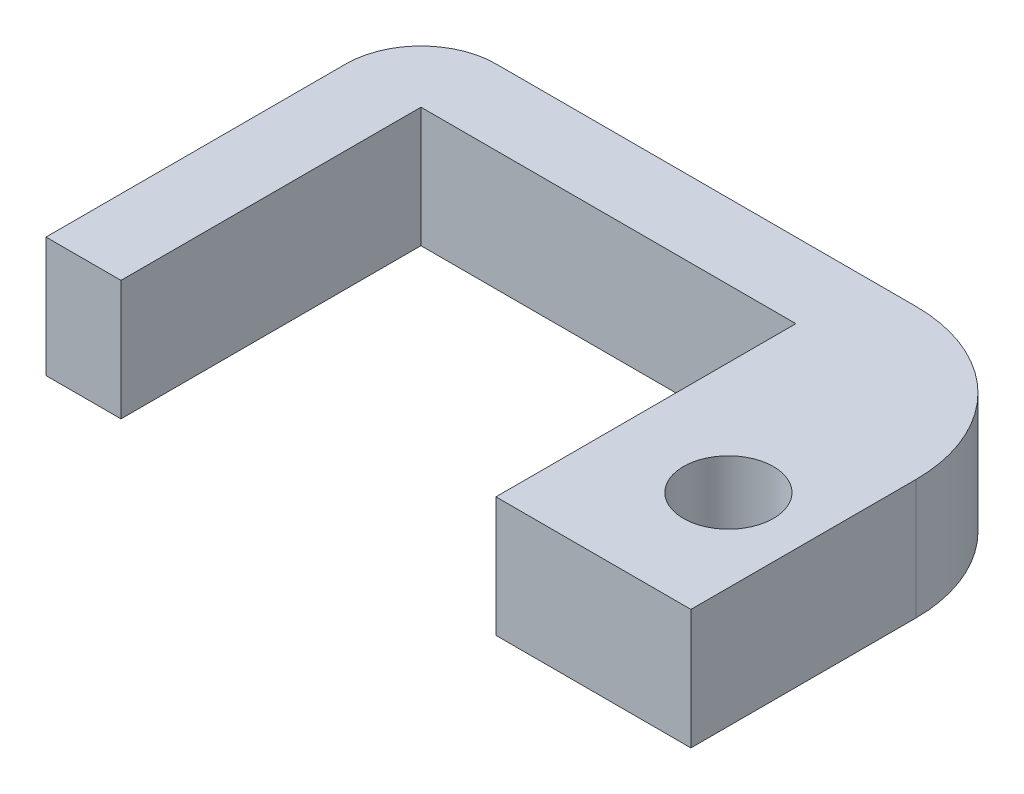
ISO-10303-21;
HEADER;
FILE_DESCRIPTION(('STEP AP214'),'2;1');
FILE_NAME('part.step','',(''),(''),'','','');
FILE_SCHEMA(('AUTOMOTIVE_DESIGN { 1 0 10303 214 1 1 1 1 }'));
ENDSEC;
DATA;
#1=APPLICATION_CONTEXT('core data for automotive mechanical design processes');
#2=APPLICATION_PROTOCOL_DEFINITION('international standard','automotive_design',2000,#1);
#3=PRODUCT_CONTEXT('',#1,'mechanical');
#4=PRODUCT('Part','Part','',(#3));
#5=PRODUCT_RELATED_PRODUCT_CATEGORY('part','',(#4));
#6=PRODUCT_DEFINITION_FORMATION('','',#4);
#7=PRODUCT_DEFINITION_CONTEXT('part definition',#1,'design');
#8=PRODUCT_DEFINITION('design','',#6,#7);
#9=PRODUCT_DEFINITION_SHAPE('','',#8);
#10=(LENGTH_UNIT() NAMED_UNIT(*) SI_UNIT(.MILLI.,.METRE.));
#11=(NAMED_UNIT(*) PLANE_ANGLE_UNIT() SI_UNIT($,.RADIAN.));
#12=(NAMED_UNIT(*) SI_UNIT($,.STERADIAN.) SOLID_ANGLE_UNIT());
#13=UNCERTAINTY_MEASURE_WITH_UNIT(LENGTH_MEASURE(1.E-05),#10,'distance_accuracy_value','');
#14=(GEOMETRIC_REPRESENTATION_CONTEXT(3) GLOBAL_UNCERTAINTY_ASSIGNED_CONTEXT((#13)) GLOBAL_UNIT_ASSIGNED_CONTEXT((#10,
#11,#12)) REPRESENTATION_CONTEXT('',''));
#15=CARTESIAN_POINT('',(0.,0.,0.));
#16=DIRECTION('',(0.,0.,1.));
#17=DIRECTION('',(1.,0.,0.));
#18=AXIS2_PLACEMENT_3D('',#15,#16,#17);
#19=CARTESIAN_POINT('',(28.,8.,-15.));
#20=DIRECTION('',(0.,-1.,0.));
#21=DIRECTION('',(0.,0.,-1.));
#22=AXIS2_PLACEMENT_3D('',#19,#20,#21);
#23=PLANE('',#22);
#24=CARTESIAN_POINT('',(32.5,8.,-8.));
#25=DIRECTION('',(0.,-1.,0.));
#26=DIRECTION('',(0.,0.,-1.));
#27=AXIS2_PLACEMENT_3D('',#24,#25,#26);
#28=CIRCLE('',#27,3.);
#29=CARTESIAN_POINT('',(32.5,8.,-11.));
#30=VERTEX_POINT('',#29);
#31=EDGE_CURVE('E146',#30,#30,#28,.T.);
#32=ORIENTED_EDGE('',*,*,#31,.T.);
#33=EDGE_LOOP('',(#32));
#34=FACE_BOUND('',#33,.T.);
#35=DIRECTION('',(1.,0.,0.));
#36=VECTOR('',#35,1.);
#37=CARTESIAN_POINT('',(-5.,8.,0.));
#38=LINE('',#37,#36);
#39=CARTESIAN_POINT('',(-5.,8.,0.));
#40=VERTEX_POINT('',#39);
#41=CARTESIAN_POINT('',(0.,8.,0.));
#42=VERTEX_POINT('',#41);
#43=EDGE_CURVE('E161',#40,#42,#38,.T.);
#44=ORIENTED_EDGE('',*,*,#43,.T.);
#45=DIRECTION('',(0.,0.,-1.));
#46=VECTOR('',#45,1.);
#47=CARTESIAN_POINT('',(0.,8.,0.));
#48=LINE('',#47,#46);
#49=CARTESIAN_POINT('',(0.,8.,-20.));
#50=VERTEX_POINT('',#49);
#51=EDGE_CURVE('E100',#42,#50,#48,.T.);
#52=ORIENTED_EDGE('',*,*,#51,.T.);
#53=DIRECTION('',(1.,0.,0.));
#54=VECTOR('',#53,1.);
#55=CARTESIAN_POINT('',(0.,8.,-20.));
#56=LINE('',#55,#54);
#57=CARTESIAN_POINT('',(25.,8.,-20.));
#58=VERTEX_POINT('',#57);
#59=EDGE_CURVE('E182',#50,#58,#56,.T.);
#60=ORIENTED_EDGE('',*,*,#59,.T.);
#61=DIRECTION('',(0.,0.,1.));
#62=VECTOR('',#61,1.);
#63=CARTESIAN_POINT('',(25.,8.,0.));
#64=LINE('',#63,#62);
#65=CARTESIAN_POINT('',(25.,8.,0.));
#66=VERTEX_POINT('',#65);
#67=EDGE_CURVE('E200',#58,#66,#64,.T.);
#68=ORIENTED_EDGE('',*,*,#67,.T.);
#69=DIRECTION('',(1.,0.,0.));
#70=VECTOR('',#69,1.);
#71=CARTESIAN_POINT('',(25.,8.,0.));
#72=LINE('',#71,#70);
#73=CARTESIAN_POINT('',(38.,8.,0.));
#74=VERTEX_POINT('',#73);
#75=EDGE_CURVE('E197',#66,#74,#72,.T.);
#76=ORIENTED_EDGE('',*,*,#75,.T.);
#77=DIRECTION('',(0.,0.,-1.));
#78=VECTOR('',#77,1.);
#79=CARTESIAN_POINT('',(38.,8.,0.));
#80=LINE('',#79,#78);
#81=CARTESIAN_POINT('',(38.,8.,-14.9999999999999));
#82=VERTEX_POINT('',#81);
#83=EDGE_CURVE('E199',#74,#82,#80,.T.);
#84=ORIENTED_EDGE('',*,*,#83,.T.);
#85=CARTESIAN_POINT('',(28.,8.,-15.));
#86=DIRECTION('',(0.,1.,0.));
#87=DIRECTION('',(0.,0.,-1.));
#88=AXIS2_PLACEMENT_3D('',#85,#86,#87);
#89=CIRCLE('',#88,10.);
#90=CARTESIAN_POINT('',(27.9999999999999,8.,-25.));
#91=VERTEX_POINT('',#90);
#92=EDGE_CURVE('E124',#82,#91,#89,.T.);
#93=ORIENTED_EDGE('',*,*,#92,.T.);
#94=DIRECTION('',(-1.,0.,0.));
#95=VECTOR('',#94,1.);
#96=CARTESIAN_POINT('',(27.9999999999999,8.,-25.));
#97=LINE('',#96,#95);
#98=CARTESIAN_POINT('',(0.,8.,-25.));
#99=VERTEX_POINT('',#98);
#100=EDGE_CURVE('E119',#91,#99,#97,.T.);
#101=ORIENTED_EDGE('',*,*,#100,.T.);
#102=CARTESIAN_POINT('',(0.,8.,-20.));
#103=DIRECTION('',(0.,1.,0.));
#104=DIRECTION('',(0.,0.,-1.));
#105=AXIS2_PLACEMENT_3D('',#102,#103,#104);
#106=CIRCLE('',#105,5.);
#107=CARTESIAN_POINT('',(-5.,8.,-20.));
#108=VERTEX_POINT('',#107);
#109=EDGE_CURVE('E122',#99,#108,#106,.T.);
#110=ORIENTED_EDGE('',*,*,#109,.T.);
#111=DIRECTION('',(0.,0.,1.));
#112=VECTOR('',#111,1.);
#113=CARTESIAN_POINT('',(-5.,8.,-20.));
#114=LINE('',#113,#112);
#115=EDGE_CURVE('E51',#108,#40,#114,.T.);
#116=ORIENTED_EDGE('',*,*,#115,.T.);
#117=EDGE_LOOP('',(#44,#52,#60,#68,#76,#84,#93,#101,#110,#116));
#118=FACE_BOUND('',#117,.T.);
#119=ADVANCED_FACE('F34',(#34,#118),#23,.F.);
#120=CARTESIAN_POINT('',(28.,0.,-15.));
#121=DIRECTION('',(0.,-1.,0.));
#122=DIRECTION('',(0.,0.,-1.));
#123=AXIS2_PLACEMENT_3D('',#120,#121,#122);
#124=PLANE('',#123);
#125=CARTESIAN_POINT('',(32.5,0.,-8.));
#126=DIRECTION('',(0.,-1.,0.));
#127=DIRECTION('',(0.,0.,-1.));
#128=AXIS2_PLACEMENT_3D('',#125,#126,#127);
#129=CIRCLE('',#128,3.);
#130=CARTESIAN_POINT('',(32.5,0.,-11.));
#131=VERTEX_POINT('',#130);
#132=EDGE_CURVE('E210',#131,#131,#129,.T.);
#133=ORIENTED_EDGE('',*,*,#132,.F.);
#134=EDGE_LOOP('',(#133));
#135=FACE_BOUND('',#134,.T.);
#136=DIRECTION('',(1.,0.,0.));
#137=VECTOR('',#136,1.);
#138=CARTESIAN_POINT('',(-5.,0.,0.));
#139=LINE('',#138,#137);
#140=CARTESIAN_POINT('',(-5.,0.,0.));
#141=VERTEX_POINT('',#140);
#142=CARTESIAN_POINT('',(0.,0.,0.));
#143=VERTEX_POINT('',#142);
#144=EDGE_CURVE('E142',#141,#143,#139,.T.);
#145=ORIENTED_EDGE('',*,*,#144,.F.);
#146=DIRECTION('',(0.,0.,1.));
#147=VECTOR('',#146,1.);
#148=CARTESIAN_POINT('',(-5.,0.,-20.));
#149=LINE('',#148,#147);
#150=CARTESIAN_POINT('',(-5.,0.,-20.));
#151=VERTEX_POINT('',#150);
#152=EDGE_CURVE('E92',#151,#141,#149,.T.);
#153=ORIENTED_EDGE('',*,*,#152,.F.);
#154=CARTESIAN_POINT('',(0.,0.,-20.));
#155=DIRECTION('',(0.,1.,0.));
#156=DIRECTION('',(0.,0.,-1.));
#157=AXIS2_PLACEMENT_3D('',#154,#155,#156);
#158=CIRCLE('',#157,5.);
#159=CARTESIAN_POINT('',(0.,0.,-25.));
#160=VERTEX_POINT('',#159);
#161=EDGE_CURVE('E86',#160,#151,#158,.T.);
#162=ORIENTED_EDGE('',*,*,#161,.F.);
#163=DIRECTION('',(-1.,0.,0.));
#164=VECTOR('',#163,1.);
#165=CARTESIAN_POINT('',(27.9999999999999,0.,-25.));
#166=LINE('',#165,#164);
#167=CARTESIAN_POINT('',(27.9999999999999,0.,-25.));
#168=VERTEX_POINT('',#167);
#169=EDGE_CURVE('E132',#168,#160,#166,.T.);
#170=ORIENTED_EDGE('',*,*,#169,.F.);
#171=CARTESIAN_POINT('',(28.,0.,-15.));
#172=DIRECTION('',(0.,1.,0.));
#173=DIRECTION('',(0.,0.,-1.));
#174=AXIS2_PLACEMENT_3D('',#171,#172,#173);
#175=CIRCLE('',#174,10.);
#176=CARTESIAN_POINT('',(38.,0.,-14.9999999999999));
#177=VERTEX_POINT('',#176);
#178=EDGE_CURVE('E156',#177,#168,#175,.T.);
#179=ORIENTED_EDGE('',*,*,#178,.F.);
#180=DIRECTION('',(0.,0.,-1.));
#181=VECTOR('',#180,1.);
#182=CARTESIAN_POINT('',(38.,0.,0.));
#183=LINE('',#182,#181);
#184=CARTESIAN_POINT('',(38.,0.,0.));
#185=VERTEX_POINT('',#184);
#186=EDGE_CURVE('E154',#185,#177,#183,.T.);
#187=ORIENTED_EDGE('',*,*,#186,.F.);
#188=DIRECTION('',(1.,0.,0.));
#189=VECTOR('',#188,1.);
#190=CARTESIAN_POINT('',(25.,0.,0.));
#191=LINE('',#190,#189);
#192=CARTESIAN_POINT('',(25.,0.,0.));
#193=VERTEX_POINT('',#192);
#194=EDGE_CURVE('E152',#193,#185,#191,.T.);
#195=ORIENTED_EDGE('',*,*,#194,.F.);
#196=DIRECTION('',(0.,0.,1.));
#197=VECTOR('',#196,1.);
#198=CARTESIAN_POINT('',(25.,0.,0.));
#199=LINE('',#198,#197);
#200=CARTESIAN_POINT('',(25.,0.,-20.));
#201=VERTEX_POINT('',#200);
#202=EDGE_CURVE('E150',#201,#193,#199,.T.);
#203=ORIENTED_EDGE('',*,*,#202,.F.);
#204=DIRECTION('',(1.,0.,0.));
#205=VECTOR('',#204,1.);
#206=CARTESIAN_POINT('',(0.,0.,-20.));
#207=LINE('',#206,#205);
#208=CARTESIAN_POINT('',(0.,0.,-20.));
#209=VERTEX_POINT('',#208);
#210=EDGE_CURVE('E148',#209,#201,#207,.T.);
#211=ORIENTED_EDGE('',*,*,#210,.F.);
#212=DIRECTION('',(0.,0.,-1.));
#213=VECTOR('',#212,1.);
#214=CARTESIAN_POINT('',(0.,0.,0.));
#215=LINE('',#214,#213);
#216=EDGE_CURVE('E145',#143,#209,#215,.T.);
#217=ORIENTED_EDGE('',*,*,#216,.F.);
#218=EDGE_LOOP('',(#145,#153,#162,#170,#179,#187,#195,#203,#211,#217));
#219=FACE_BOUND('',#218,.T.);
#220=ADVANCED_FACE('F186',(#135,#219),#124,.T.);
#221=CARTESIAN_POINT('',(-5.,8.,0.));
#222=DIRECTION('',(0.,0.,-1.));
#223=DIRECTION('',(-1.,0.,0.));
#224=AXIS2_PLACEMENT_3D('',#221,#222,#223);
#225=PLANE('',#224);
#226=ORIENTED_EDGE('',*,*,#144,.T.);
#227=DIRECTION('',(0.,-1.,0.));
#228=VECTOR('',#227,1.);
#229=CARTESIAN_POINT('',(0.,8.,0.));
#230=LINE('',#229,#228);
#231=EDGE_CURVE('E11',#42,#143,#230,.T.);
#232=ORIENTED_EDGE('',*,*,#231,.F.);
#233=ORIENTED_EDGE('',*,*,#43,.F.);
#234=DIRECTION('',(0.,-1.,0.));
#235=VECTOR('',#234,1.);
#236=CARTESIAN_POINT('',(-5.,8.,0.));
#237=LINE('',#236,#235);
#238=EDGE_CURVE('E138',#40,#141,#237,.T.);
#239=ORIENTED_EDGE('',*,*,#238,.T.);
#240=EDGE_LOOP('',(#226,#232,#233,#239));
#241=FACE_BOUND('',#240,.T.);
#242=ADVANCED_FACE('F36',(#241),#225,.F.);
#243=CARTESIAN_POINT('',(0.,8.,0.));
#244=DIRECTION('',(-1.,0.,0.));
#245=DIRECTION('',(0.,0.,1.));
#246=AXIS2_PLACEMENT_3D('',#243,#244,#245);
#247=PLANE('',#246);
#248=ORIENTED_EDGE('',*,*,#216,.T.);
#249=DIRECTION('',(0.,-1.,0.));
#250=VECTOR('',#249,1.);
#251=CARTESIAN_POINT('',(0.,8.,-20.));
#252=LINE('',#251,#250);
#253=EDGE_CURVE('E43',#50,#209,#252,.T.);
#254=ORIENTED_EDGE('',*,*,#253,.F.);
#255=ORIENTED_EDGE('',*,*,#51,.F.);
#256=ORIENTED_EDGE('',*,*,#231,.T.);
#257=EDGE_LOOP('',(#248,#254,#255,#256));
#258=FACE_BOUND('',#257,.T.);
#259=ADVANCED_FACE('F223',(#258),#247,.F.);
#260=CARTESIAN_POINT('',(0.,8.,-20.));
#261=DIRECTION('',(0.,0.,-1.));
#262=DIRECTION('',(-1.,0.,0.));
#263=AXIS2_PLACEMENT_3D('',#260,#261,#262);
#264=PLANE('',#263);
#265=ORIENTED_EDGE('',*,*,#210,.T.);
#266=DIRECTION('',(0.,-1.,0.));
#267=VECTOR('',#266,1.);
#268=CARTESIAN_POINT('',(25.,8.,-20.));
#269=LINE('',#268,#267);
#270=EDGE_CURVE('E174',#58,#201,#269,.T.);
#271=ORIENTED_EDGE('',*,*,#270,.F.);
#272=ORIENTED_EDGE('',*,*,#59,.F.);
#273=ORIENTED_EDGE('',*,*,#253,.T.);
#274=EDGE_LOOP('',(#265,#271,#272,#273));
#275=FACE_BOUND('',#274,.T.);
#276=ADVANCED_FACE('F180',(#275),#264,.F.);
#277=CARTESIAN_POINT('',(25.,8.,0.));
#278=DIRECTION('',(1.,0.,0.));
#279=DIRECTION('',(0.,0.,-1.));
#280=AXIS2_PLACEMENT_3D('',#277,#278,#279);
#281=PLANE('',#280);
#282=ORIENTED_EDGE('',*,*,#202,.T.);
#283=DIRECTION('',(0.,-1.,0.));
#284=VECTOR('',#283,1.);
#285=CARTESIAN_POINT('',(25.,8.,0.));
#286=LINE('',#285,#284);
#287=EDGE_CURVE('E171',#66,#193,#286,.T.);
#288=ORIENTED_EDGE('',*,*,#287,.F.);
#289=ORIENTED_EDGE('',*,*,#67,.F.);
#290=ORIENTED_EDGE('',*,*,#270,.T.);
#291=EDGE_LOOP('',(#282,#288,#289,#290));
#292=FACE_BOUND('',#291,.T.);
#293=ADVANCED_FACE('F191',(#292),#281,.F.);
#294=CARTESIAN_POINT('',(25.,8.,0.));
#295=DIRECTION('',(0.,0.,-1.));
#296=DIRECTION('',(-1.,0.,0.));
#297=AXIS2_PLACEMENT_3D('',#294,#295,#296);
#298=PLANE('',#297);
#299=ORIENTED_EDGE('',*,*,#194,.T.);
#300=DIRECTION('',(0.,-1.,0.));
#301=VECTOR('',#300,1.);
#302=CARTESIAN_POINT('',(38.,8.,0.));
#303=LINE('',#302,#301);
#304=EDGE_CURVE('E168',#74,#185,#303,.T.);
#305=ORIENTED_EDGE('',*,*,#304,.F.);
#306=ORIENTED_EDGE('',*,*,#75,.F.);
#307=ORIENTED_EDGE('',*,*,#287,.T.);
#308=EDGE_LOOP('',(#299,#305,#306,#307));
#309=FACE_BOUND('',#308,.T.);
#310=ADVANCED_FACE('F195',(#309),#298,.F.);
#311=CARTESIAN_POINT('',(38.,8.,0.));
#312=DIRECTION('',(-1.,0.,0.));
#313=DIRECTION('',(0.,0.,1.));
#314=AXIS2_PLACEMENT_3D('',#311,#312,#313);
#315=PLANE('',#314);
#316=ORIENTED_EDGE('',*,*,#186,.T.);
#317=DIRECTION('',(0.,-1.,0.));
#318=VECTOR('',#317,1.);
#319=CARTESIAN_POINT('',(38.,8.,-14.9999999999999));
#320=LINE('',#319,#318);
#321=EDGE_CURVE('E165',#82,#177,#320,.T.);
#322=ORIENTED_EDGE('',*,*,#321,.F.);
#323=ORIENTED_EDGE('',*,*,#83,.F.);
#324=ORIENTED_EDGE('',*,*,#304,.T.);
#325=EDGE_LOOP('',(#316,#322,#323,#324));
#326=FACE_BOUND('',#325,.T.);
#327=ADVANCED_FACE('F239',(#326),#315,.F.);
#328=CARTESIAN_POINT('',(28.,8.,-15.));
#329=DIRECTION('',(0.,-1.,0.));
#330=DIRECTION('',(0.,0.,-1.));
#331=AXIS2_PLACEMENT_3D('',#328,#329,#330);
#332=CYLINDRICAL_SURFACE('',#331,10.);
#333=ORIENTED_EDGE('',*,*,#178,.T.);
#334=DIRECTION('',(0.,-1.,0.));
#335=VECTOR('',#334,1.);
#336=CARTESIAN_POINT('',(27.9999999999999,8.,-25.));
#337=LINE('',#336,#335);
#338=EDGE_CURVE('E133',#91,#168,#337,.T.);
#339=ORIENTED_EDGE('',*,*,#338,.F.);
#340=ORIENTED_EDGE('',*,*,#92,.F.);
#341=ORIENTED_EDGE('',*,*,#321,.T.);
#342=EDGE_LOOP('',(#333,#339,#340,#341));
#343=FACE_BOUND('',#342,.T.);
#344=ADVANCED_FACE('F236',(#343),#332,.T.);
#345=CARTESIAN_POINT('',(27.9999999999999,8.,-25.));
#346=DIRECTION('',(0.,0.,1.));
#347=DIRECTION('',(1.,0.,0.));
#348=AXIS2_PLACEMENT_3D('',#345,#346,#347);
#349=PLANE('',#348);
#350=ORIENTED_EDGE('',*,*,#169,.T.);
#351=DIRECTION('',(0.,-1.,0.));
#352=VECTOR('',#351,1.);
#353=CARTESIAN_POINT('',(0.,8.,-25.));
#354=LINE('',#353,#352);
#355=EDGE_CURVE('E129',#99,#160,#354,.T.);
#356=ORIENTED_EDGE('',*,*,#355,.F.);
#357=ORIENTED_EDGE('',*,*,#100,.F.);
#358=ORIENTED_EDGE('',*,*,#338,.T.);
#359=EDGE_LOOP('',(#350,#356,#357,#358));
#360=FACE_BOUND('',#359,.T.);
#361=ADVANCED_FACE('F130',(#360),#349,.F.);
#362=CARTESIAN_POINT('',(0.,8.,-20.));
#363=DIRECTION('',(0.,-1.,0.));
#364=DIRECTION('',(0.,0.,-1.));
#365=AXIS2_PLACEMENT_3D('',#362,#363,#364);
#366=CYLINDRICAL_SURFACE('',#365,5.);
#367=ORIENTED_EDGE('',*,*,#161,.T.);
#368=DIRECTION('',(0.,-1.,0.));
#369=VECTOR('',#368,1.);
#370=CARTESIAN_POINT('',(-5.,8.,-20.));
#371=LINE('',#370,#369);
#372=EDGE_CURVE('E134',#108,#151,#371,.T.);
#373=ORIENTED_EDGE('',*,*,#372,.F.);
#374=ORIENTED_EDGE('',*,*,#109,.F.);
#375=ORIENTED_EDGE('',*,*,#355,.T.);
#376=EDGE_LOOP('',(#367,#373,#374,#375));
#377=FACE_BOUND('',#376,.T.);
#378=ADVANCED_FACE('F136',(#377),#366,.T.);
#379=CARTESIAN_POINT('',(-5.,8.,-20.));
#380=DIRECTION('',(1.,0.,0.));
#381=DIRECTION('',(0.,0.,-1.));
#382=AXIS2_PLACEMENT_3D('',#379,#380,#381);
#383=PLANE('',#382);
#384=ORIENTED_EDGE('',*,*,#152,.T.);
#385=ORIENTED_EDGE('',*,*,#238,.F.);
#386=ORIENTED_EDGE('',*,*,#115,.F.);
#387=ORIENTED_EDGE('',*,*,#372,.T.);
#388=EDGE_LOOP('',(#384,#385,#386,#387));
#389=FACE_BOUND('',#388,.T.);
#390=ADVANCED_FACE('F229',(#389),#383,.F.);
#391=CARTESIAN_POINT('',(32.5,9.,-8.));
#392=DIRECTION('',(0.,-1.,0.));
#393=DIRECTION('',(0.,0.,-1.));
#394=AXIS2_PLACEMENT_3D('',#391,#392,#393);
#395=CYLINDRICAL_SURFACE('',#394,3.);
#396=ORIENTED_EDGE('',*,*,#132,.T.);
#397=EDGE_LOOP('',(#396));
#398=FACE_BOUND('',#397,.T.);
#399=ORIENTED_EDGE('',*,*,#31,.F.);
#400=EDGE_LOOP('',(#399));
#401=FACE_BOUND('',#400,.T.);
#402=ADVANCED_FACE('F214',(#398,#401),#395,.F.);
#403=CLOSED_SHELL('',(#119,#220,#242,#259,#276,#293,#310,#327,#344,#361,#378,#390,#402));
#404=MANIFOLD_SOLID_BREP('B2',#403);
#405=ADVANCED_BREP_SHAPE_REPRESENTATION('',(#18,#404),#14);
#406=SHAPE_DEFINITION_REPRESENTATION(#9,#405);
ENDSEC;
END-ISO-10303-21;
